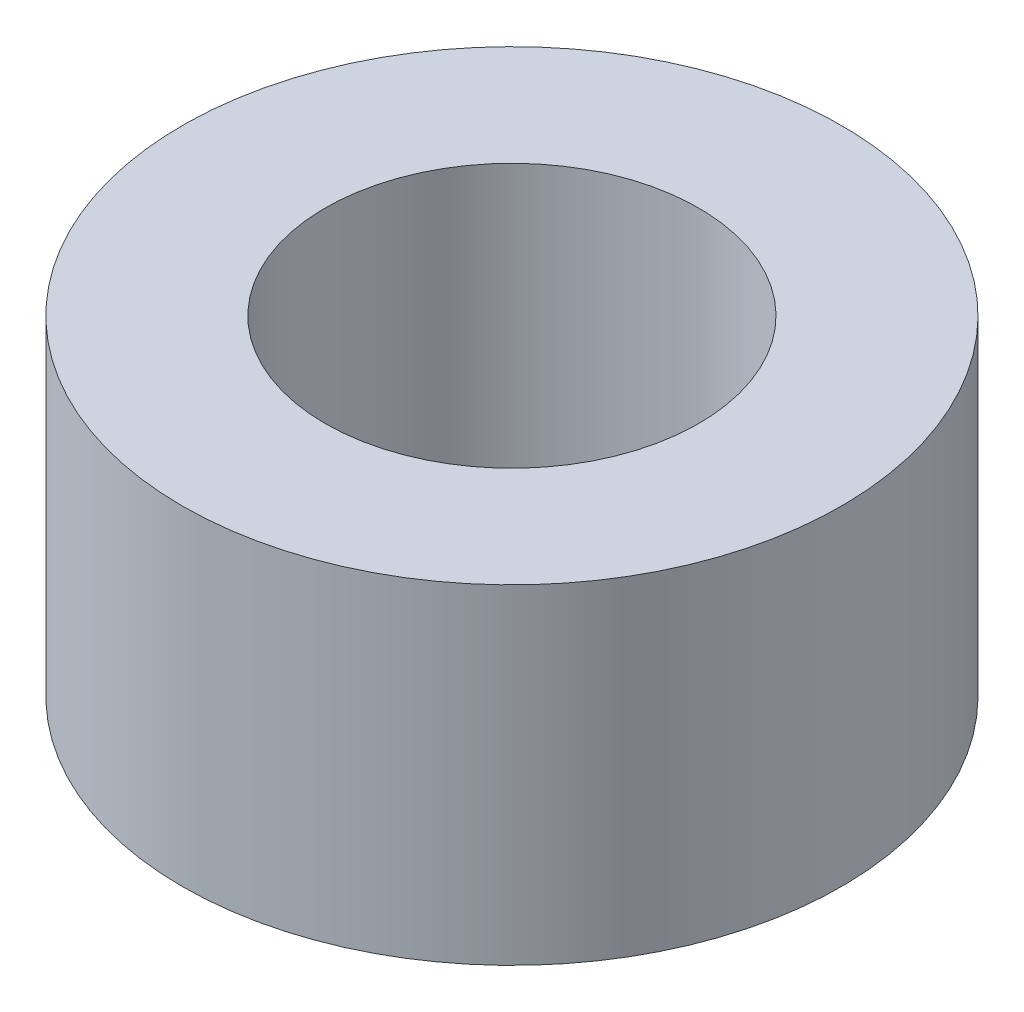
ISO-10303-21;
HEADER;
FILE_DESCRIPTION(('STEP AP214'),'2;1');
FILE_NAME('part.step','',(''),(''),'','','');
FILE_SCHEMA(('AUTOMOTIVE_DESIGN { 1 0 10303 214 1 1 1 1 }'));
ENDSEC;
DATA;
#1=APPLICATION_CONTEXT('core data for automotive mechanical design processes');
#2=APPLICATION_PROTOCOL_DEFINITION('international standard','automotive_design',2000,#1);
#3=PRODUCT_CONTEXT('',#1,'mechanical');
#4=PRODUCT('Part','Part','',(#3));
#5=PRODUCT_RELATED_PRODUCT_CATEGORY('part','',(#4));
#6=PRODUCT_DEFINITION_FORMATION('','',#4);
#7=PRODUCT_DEFINITION_CONTEXT('part definition',#1,'design');
#8=PRODUCT_DEFINITION('design','',#6,#7);
#9=PRODUCT_DEFINITION_SHAPE('','',#8);
#10=(LENGTH_UNIT() NAMED_UNIT(*) SI_UNIT(.MILLI.,.METRE.));
#11=(NAMED_UNIT(*) PLANE_ANGLE_UNIT() SI_UNIT($,.RADIAN.));
#12=(NAMED_UNIT(*) SI_UNIT($,.STERADIAN.) SOLID_ANGLE_UNIT());
#13=UNCERTAINTY_MEASURE_WITH_UNIT(LENGTH_MEASURE(1.E-05),#10,'distance_accuracy_value','');
#14=(GEOMETRIC_REPRESENTATION_CONTEXT(3) GLOBAL_UNCERTAINTY_ASSIGNED_CONTEXT((#13)) GLOBAL_UNIT_ASSIGNED_CONTEXT((#10,
#11,#12)) REPRESENTATION_CONTEXT('',''));
#15=CARTESIAN_POINT('',(0.,0.,0.));
#16=DIRECTION('',(0.,0.,1.));
#17=DIRECTION('',(1.,0.,0.));
#18=AXIS2_PLACEMENT_3D('',#15,#16,#17);
#19=CARTESIAN_POINT('',(0.,3.,0.));
#20=DIRECTION('',(0.,1.,0.));
#21=DIRECTION('',(0.,0.,1.));
#22=AXIS2_PLACEMENT_3D('',#19,#20,#21);
#23=PLANE('',#22);
#24=CARTESIAN_POINT('',(0.,3.,0.));
#25=DIRECTION('',(0.,1.,0.));
#26=DIRECTION('',(0.,0.,1.));
#27=AXIS2_PLACEMENT_3D('',#24,#25,#26);
#28=CIRCLE('',#27,3.);
#29=CARTESIAN_POINT('',(0.,3.,3.));
#30=VERTEX_POINT('',#29);
#31=EDGE_CURVE('E10',#30,#30,#28,.T.);
#32=ORIENTED_EDGE('',*,*,#31,.T.);
#33=EDGE_LOOP('',(#32));
#34=FACE_BOUND('',#33,.T.);
#35=CARTESIAN_POINT('',(0.,3.,0.));
#36=DIRECTION('',(0.,1.,0.));
#37=DIRECTION('',(0.,0.,1.));
#38=AXIS2_PLACEMENT_3D('',#35,#36,#37);
#39=CIRCLE('',#38,1.7);
#40=CARTESIAN_POINT('',(0.,3.,1.7));
#41=VERTEX_POINT('',#40);
#42=EDGE_CURVE('E54',#41,#41,#39,.T.);
#43=ORIENTED_EDGE('',*,*,#42,.F.);
#44=EDGE_LOOP('',(#43));
#45=FACE_BOUND('',#44,.T.);
#46=ADVANCED_FACE('F41',(#34,#45),#23,.T.);
#47=CARTESIAN_POINT('',(0.,0.,0.));
#48=DIRECTION('',(0.,1.,0.));
#49=DIRECTION('',(0.,0.,1.));
#50=AXIS2_PLACEMENT_3D('',#47,#48,#49);
#51=PLANE('',#50);
#52=CARTESIAN_POINT('',(0.,0.,0.));
#53=DIRECTION('',(0.,1.,0.));
#54=DIRECTION('',(0.,0.,1.));
#55=AXIS2_PLACEMENT_3D('',#52,#53,#54);
#56=CIRCLE('',#55,3.);
#57=CARTESIAN_POINT('',(0.,0.,3.));
#58=VERTEX_POINT('',#57);
#59=EDGE_CURVE('E45',#58,#58,#56,.T.);
#60=ORIENTED_EDGE('',*,*,#59,.F.);
#61=EDGE_LOOP('',(#60));
#62=FACE_BOUND('',#61,.T.);
#63=CARTESIAN_POINT('',(0.,0.,0.));
#64=DIRECTION('',(0.,1.,0.));
#65=DIRECTION('',(0.,0.,1.));
#66=AXIS2_PLACEMENT_3D('',#63,#64,#65);
#67=CIRCLE('',#66,1.7);
#68=CARTESIAN_POINT('',(0.,0.,1.7));
#69=VERTEX_POINT('',#68);
#70=EDGE_CURVE('E56',#69,#69,#67,.T.);
#71=ORIENTED_EDGE('',*,*,#70,.T.);
#72=EDGE_LOOP('',(#71));
#73=FACE_BOUND('',#72,.T.);
#74=ADVANCED_FACE('F68',(#62,#73),#51,.F.);
#75=CARTESIAN_POINT('',(0.,3.,0.));
#76=DIRECTION('',(0.,-1.,0.));
#77=DIRECTION('',(0.,0.,-1.));
#78=AXIS2_PLACEMENT_3D('',#75,#76,#77);
#79=CYLINDRICAL_SURFACE('',#78,3.);
#80=ORIENTED_EDGE('',*,*,#31,.F.);
#81=EDGE_LOOP('',(#80));
#82=FACE_BOUND('',#81,.T.);
#83=ORIENTED_EDGE('',*,*,#59,.T.);
#84=EDGE_LOOP('',(#83));
#85=FACE_BOUND('',#84,.T.);
#86=ADVANCED_FACE('F43',(#82,#85),#79,.T.);
#87=CARTESIAN_POINT('',(0.,3.,0.));
#88=DIRECTION('',(0.,-1.,0.));
#89=DIRECTION('',(0.,0.,-1.));
#90=AXIS2_PLACEMENT_3D('',#87,#88,#89);
#91=CYLINDRICAL_SURFACE('',#90,1.7);
#92=ORIENTED_EDGE('',*,*,#42,.T.);
#93=EDGE_LOOP('',(#92));
#94=FACE_BOUND('',#93,.T.);
#95=ORIENTED_EDGE('',*,*,#70,.F.);
#96=EDGE_LOOP('',(#95));
#97=FACE_BOUND('',#96,.T.);
#98=ADVANCED_FACE('F64',(#94,#97),#91,.F.);
#99=CLOSED_SHELL('',(#46,#74,#86,#98));
#100=MANIFOLD_SOLID_BREP('B2',#99);
#101=ADVANCED_BREP_SHAPE_REPRESENTATION('',(#18,#100),#14);
#102=SHAPE_DEFINITION_REPRESENTATION(#9,#101);
ENDSEC;
END-ISO-10303-21;
